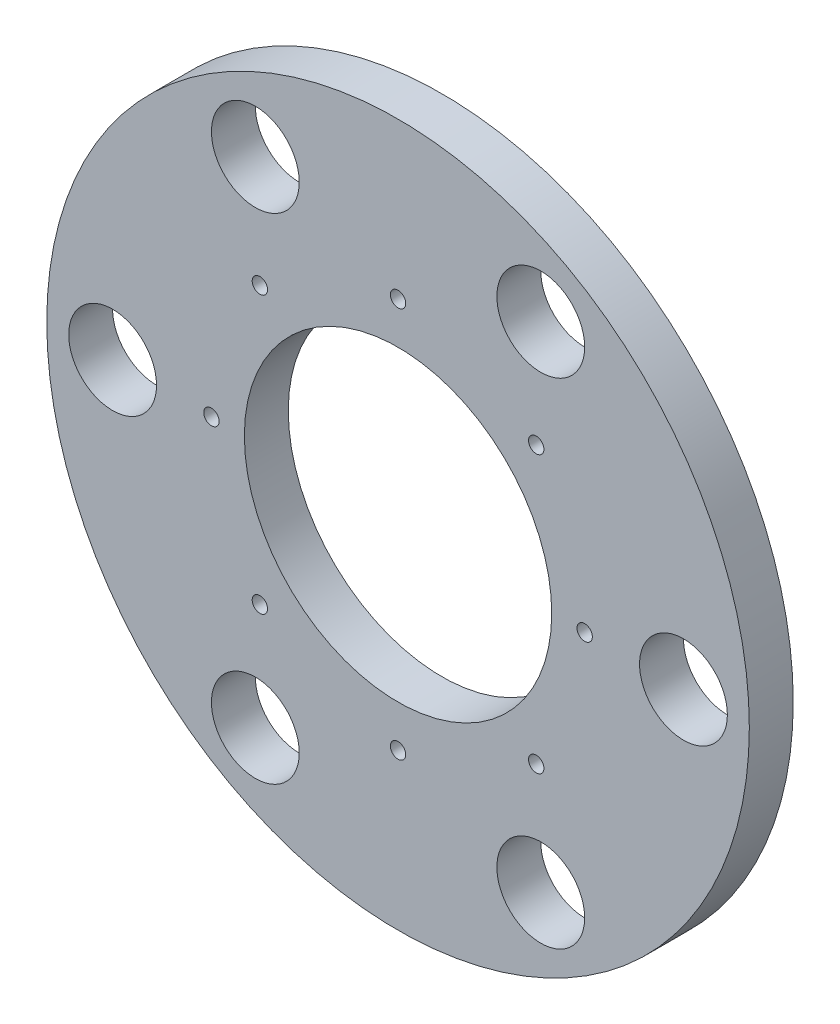
ISO-10303-21;
HEADER;
FILE_DESCRIPTION(('STEP AP214'),'2;1');
FILE_NAME('part.step','',(''),(''),'','','');
FILE_SCHEMA(('AUTOMOTIVE_DESIGN { 1 0 10303 214 1 1 1 1 }'));
ENDSEC;
DATA;
#1=APPLICATION_CONTEXT('core data for automotive mechanical design processes');
#2=APPLICATION_PROTOCOL_DEFINITION('international standard','automotive_design',2000,#1);
#3=PRODUCT_CONTEXT('',#1,'mechanical');
#4=PRODUCT('Part','Part','',(#3));
#5=PRODUCT_RELATED_PRODUCT_CATEGORY('part','',(#4));
#6=PRODUCT_DEFINITION_FORMATION('','',#4);
#7=PRODUCT_DEFINITION_CONTEXT('part definition',#1,'design');
#8=PRODUCT_DEFINITION('design','',#6,#7);
#9=PRODUCT_DEFINITION_SHAPE('','',#8);
#10=(LENGTH_UNIT() NAMED_UNIT(*) SI_UNIT(.MILLI.,.METRE.));
#11=(NAMED_UNIT(*) PLANE_ANGLE_UNIT() SI_UNIT($,.RADIAN.));
#12=(NAMED_UNIT(*) SI_UNIT($,.STERADIAN.) SOLID_ANGLE_UNIT());
#13=UNCERTAINTY_MEASURE_WITH_UNIT(LENGTH_MEASURE(1.E-05),#10,'distance_accuracy_value','');
#14=(GEOMETRIC_REPRESENTATION_CONTEXT(3) GLOBAL_UNCERTAINTY_ASSIGNED_CONTEXT((#13)) GLOBAL_UNIT_ASSIGNED_CONTEXT((#10,
#11,#12)) REPRESENTATION_CONTEXT('',''));
#15=CARTESIAN_POINT('',(0.,0.,0.));
#16=DIRECTION('',(0.,0.,1.));
#17=DIRECTION('',(1.,0.,0.));
#18=AXIS2_PLACEMENT_3D('',#15,#16,#17);
#19=CARTESIAN_POINT('',(0.,0.,-10.));
#20=DIRECTION('',(0.,0.,1.));
#21=DIRECTION('',(1.,0.,0.));
#22=AXIS2_PLACEMENT_3D('',#19,#20,#21);
#23=CYLINDRICAL_SURFACE('',#22,80.);
#24=CARTESIAN_POINT('',(0.,0.,-10.));
#25=DIRECTION('',(0.,0.,1.));
#26=DIRECTION('',(1.,0.,0.));
#27=AXIS2_PLACEMENT_3D('',#24,#25,#26);
#28=CIRCLE('',#27,80.);
#29=CARTESIAN_POINT('',(80.,0.,-10.));
#30=VERTEX_POINT('',#29);
#31=EDGE_CURVE('E10',#30,#30,#28,.T.);
#32=ORIENTED_EDGE('',*,*,#31,.T.);
#33=EDGE_LOOP('',(#32));
#34=FACE_BOUND('',#33,.T.);
#35=CARTESIAN_POINT('',(0.,0.,0.));
#36=DIRECTION('',(0.,0.,1.));
#37=DIRECTION('',(1.,0.,0.));
#38=AXIS2_PLACEMENT_3D('',#35,#36,#37);
#39=CIRCLE('',#38,80.);
#40=CARTESIAN_POINT('',(80.,0.,0.));
#41=VERTEX_POINT('',#40);
#42=EDGE_CURVE('E43',#41,#41,#39,.T.);
#43=ORIENTED_EDGE('',*,*,#42,.F.);
#44=EDGE_LOOP('',(#43));
#45=FACE_BOUND('',#44,.T.);
#46=ADVANCED_FACE('F40',(#34,#45),#23,.T.);
#47=CARTESIAN_POINT('',(0.,0.,-10.));
#48=DIRECTION('',(0.,0.,1.));
#49=DIRECTION('',(1.,0.,0.));
#50=AXIS2_PLACEMENT_3D('',#47,#48,#49);
#51=PLANE('',#50);
#52=CARTESIAN_POINT('',(0.,0.,-10.));
#53=DIRECTION('',(0.,0.,1.));
#54=DIRECTION('',(1.,0.,0.));
#55=AXIS2_PLACEMENT_3D('',#52,#53,#54);
#56=CIRCLE('',#55,35.);
#57=CARTESIAN_POINT('',(35.,0.,-10.));
#58=VERTEX_POINT('',#57);
#59=EDGE_CURVE('E145',#58,#58,#56,.T.);
#60=ORIENTED_EDGE('',*,*,#59,.T.);
#61=EDGE_LOOP('',(#60));
#62=FACE_BOUND('',#61,.T.);
#63=CARTESIAN_POINT('',(1.55370919578519E-13,44.5,-10.));
#64=DIRECTION('',(0.,0.,1.));
#65=DIRECTION('',(1.,0.,0.));
#66=AXIS2_PLACEMENT_3D('',#63,#64,#65);
#67=CIRCLE('',#66,1.75);
#68=CARTESIAN_POINT('',(1.75000000000016,44.5,-10.));
#69=VERTEX_POINT('',#68);
#70=EDGE_CURVE('E71',#69,#69,#67,.T.);
#71=ORIENTED_EDGE('',*,*,#70,.T.);
#72=EDGE_LOOP('',(#71));
#73=FACE_BOUND('',#72,.T.);
#74=CARTESIAN_POINT('',(-4.66112758735558E-13,-44.5,-10.));
#75=DIRECTION('',(0.,0.,1.));
#76=DIRECTION('',(1.,0.,0.));
#77=AXIS2_PLACEMENT_3D('',#74,#75,#76);
#78=CIRCLE('',#77,1.75000000000001);
#79=CARTESIAN_POINT('',(1.74999999999954,-44.5,-10.));
#80=VERTEX_POINT('',#79);
#81=EDGE_CURVE('E140',#80,#80,#78,.T.);
#82=ORIENTED_EDGE('',*,*,#81,.T.);
#83=EDGE_LOOP('',(#82));
#84=FACE_BOUND('',#83,.T.);
#85=CARTESIAN_POINT('',(-31.4662517628013,31.4662517628014,-10.));
#86=DIRECTION('',(0.,0.,1.));
#87=DIRECTION('',(1.,0.,0.));
#88=AXIS2_PLACEMENT_3D('',#85,#86,#87);
#89=CIRCLE('',#88,1.75);
#90=CARTESIAN_POINT('',(-29.7162517628013,31.4662517628014,-10.));
#91=VERTEX_POINT('',#90);
#92=EDGE_CURVE('E149',#91,#91,#89,.T.);
#93=ORIENTED_EDGE('',*,*,#92,.T.);
#94=EDGE_LOOP('',(#93));
#95=FACE_BOUND('',#94,.T.);
#96=CARTESIAN_POINT('',(-42.5,0.,-10.));
#97=DIRECTION('',(0.,0.,1.));
#98=DIRECTION('',(1.,0.,0.));
#99=AXIS2_PLACEMENT_3D('',#96,#97,#98);
#100=CIRCLE('',#99,1.75);
#101=CARTESIAN_POINT('',(-40.75,0.,-10.));
#102=VERTEX_POINT('',#101);
#103=EDGE_CURVE('E157',#102,#102,#100,.T.);
#104=ORIENTED_EDGE('',*,*,#103,.T.);
#105=EDGE_LOOP('',(#104));
#106=FACE_BOUND('',#105,.T.);
#107=CARTESIAN_POINT('',(-31.4662517628018,-31.466251762801,-10.));
#108=DIRECTION('',(0.,0.,1.));
#109=DIRECTION('',(1.,0.,0.));
#110=AXIS2_PLACEMENT_3D('',#107,#108,#109);
#111=CIRCLE('',#110,1.75);
#112=CARTESIAN_POINT('',(-29.7162517628018,-31.466251762801,-10.));
#113=VERTEX_POINT('',#112);
#114=EDGE_CURVE('E106',#113,#113,#111,.T.);
#115=ORIENTED_EDGE('',*,*,#114,.T.);
#116=EDGE_LOOP('',(#115));
#117=FACE_BOUND('',#116,.T.);
#118=CARTESIAN_POINT('',(31.4662517628011,-31.4662517628016,-10.));
#119=DIRECTION('',(0.,0.,1.));
#120=DIRECTION('',(1.,0.,0.));
#121=AXIS2_PLACEMENT_3D('',#118,#119,#120);
#122=CIRCLE('',#121,1.75);
#123=CARTESIAN_POINT('',(33.2162517628011,-31.4662517628016,-10.));
#124=VERTEX_POINT('',#123);
#125=EDGE_CURVE('E115',#124,#124,#122,.T.);
#126=ORIENTED_EDGE('',*,*,#125,.T.);
#127=EDGE_LOOP('',(#126));
#128=FACE_BOUND('',#127,.T.);
#129=CARTESIAN_POINT('',(42.5,-2.9157116490529E-13,-10.));
#130=DIRECTION('',(0.,0.,1.));
#131=DIRECTION('',(1.,0.,0.));
#132=AXIS2_PLACEMENT_3D('',#129,#130,#131);
#133=CIRCLE('',#132,1.75);
#134=CARTESIAN_POINT('',(44.25,-2.9157116490529E-13,-10.));
#135=VERTEX_POINT('',#134);
#136=EDGE_CURVE('E123',#135,#135,#133,.T.);
#137=ORIENTED_EDGE('',*,*,#136,.T.);
#138=EDGE_LOOP('',(#137));
#139=FACE_BOUND('',#138,.T.);
#140=CARTESIAN_POINT('',(31.4662517628015,31.4662517628012,-10.));
#141=DIRECTION('',(0.,0.,1.));
#142=DIRECTION('',(1.,0.,0.));
#143=AXIS2_PLACEMENT_3D('',#140,#141,#142);
#144=CIRCLE('',#143,1.75);
#145=CARTESIAN_POINT('',(33.2162517628015,31.4662517628012,-10.));
#146=VERTEX_POINT('',#145);
#147=EDGE_CURVE('E131',#146,#146,#144,.T.);
#148=ORIENTED_EDGE('',*,*,#147,.T.);
#149=EDGE_LOOP('',(#148));
#150=FACE_BOUND('',#149,.T.);
#151=CARTESIAN_POINT('',(32.5000000000003,56.2916512459884,-10.));
#152=DIRECTION('',(0.,0.,1.));
#153=DIRECTION('',(1.,0.,0.));
#154=AXIS2_PLACEMENT_3D('',#151,#152,#153);
#155=CIRCLE('',#154,10.);
#156=CARTESIAN_POINT('',(42.5000000000003,56.2916512459884,-10.));
#157=VERTEX_POINT('',#156);
#158=EDGE_CURVE('E70',#157,#157,#155,.T.);
#159=ORIENTED_EDGE('',*,*,#158,.T.);
#160=EDGE_LOOP('',(#159));
#161=FACE_BOUND('',#160,.T.);
#162=CARTESIAN_POINT('',(65.,-4.45932369855149E-13,-10.));
#163=DIRECTION('',(0.,0.,1.));
#164=DIRECTION('',(1.,0.,0.));
#165=AXIS2_PLACEMENT_3D('',#162,#163,#164);
#166=CIRCLE('',#165,10.);
#167=CARTESIAN_POINT('',(75.,-4.45932369855149E-13,-10.));
#168=VERTEX_POINT('',#167);
#169=EDGE_CURVE('E79',#168,#168,#166,.T.);
#170=ORIENTED_EDGE('',*,*,#169,.T.);
#171=EDGE_LOOP('',(#170));
#172=FACE_BOUND('',#171,.T.);
#173=CARTESIAN_POINT('',(32.4999999999995,-56.2916512459888,-10.));
#174=DIRECTION('',(0.,0.,1.));
#175=DIRECTION('',(1.,0.,0.));
#176=AXIS2_PLACEMENT_3D('',#173,#174,#175);
#177=CIRCLE('',#176,10.);
#178=CARTESIAN_POINT('',(42.4999999999995,-56.2916512459888,-10.));
#179=VERTEX_POINT('',#178);
#180=EDGE_CURVE('E87',#179,#179,#177,.T.);
#181=ORIENTED_EDGE('',*,*,#180,.T.);
#182=EDGE_LOOP('',(#181));
#183=FACE_BOUND('',#182,.T.);
#184=CARTESIAN_POINT('',(-32.5000000000007,-56.2916512459882,-10.));
#185=DIRECTION('',(0.,0.,1.));
#186=DIRECTION('',(1.,0.,0.));
#187=AXIS2_PLACEMENT_3D('',#184,#185,#186);
#188=CIRCLE('',#187,10.);
#189=CARTESIAN_POINT('',(-22.5000000000006,-56.2916512459882,-10.));
#190=VERTEX_POINT('',#189);
#191=EDGE_CURVE('E95',#190,#190,#188,.T.);
#192=ORIENTED_EDGE('',*,*,#191,.T.);
#193=EDGE_LOOP('',(#192));
#194=FACE_BOUND('',#193,.T.);
#195=CARTESIAN_POINT('',(-65.,0.,-10.));
#196=DIRECTION('',(0.,0.,1.));
#197=DIRECTION('',(1.,0.,0.));
#198=AXIS2_PLACEMENT_3D('',#195,#196,#197);
#199=CIRCLE('',#198,10.);
#200=CARTESIAN_POINT('',(-55.,0.,-10.));
#201=VERTEX_POINT('',#200);
#202=EDGE_CURVE('E62',#201,#201,#199,.T.);
#203=ORIENTED_EDGE('',*,*,#202,.T.);
#204=EDGE_LOOP('',(#203));
#205=FACE_BOUND('',#204,.T.);
#206=CARTESIAN_POINT('',(-32.4999999999999,56.2916512459886,-10.));
#207=DIRECTION('',(0.,0.,1.));
#208=DIRECTION('',(1.,0.,0.));
#209=AXIS2_PLACEMENT_3D('',#206,#207,#208);
#210=CIRCLE('',#209,10.);
#211=CARTESIAN_POINT('',(-22.4999999999999,56.2916512459886,-10.));
#212=VERTEX_POINT('',#211);
#213=EDGE_CURVE('E57',#212,#212,#210,.T.);
#214=ORIENTED_EDGE('',*,*,#213,.T.);
#215=EDGE_LOOP('',(#214));
#216=FACE_BOUND('',#215,.T.);
#217=ORIENTED_EDGE('',*,*,#31,.F.);
#218=EDGE_LOOP('',(#217));
#219=FACE_BOUND('',#218,.T.);
#220=ADVANCED_FACE('F174',(#62,#73,#84,#95,#106,#117,#128,#139,#150,#161,#172,#183,#194,#205,
#216,#219),#51,.F.);
#221=CARTESIAN_POINT('',(0.,0.,0.));
#222=DIRECTION('',(0.,0.,1.));
#223=DIRECTION('',(1.,0.,0.));
#224=AXIS2_PLACEMENT_3D('',#221,#222,#223);
#225=PLANE('',#224);
#226=CARTESIAN_POINT('',(1.55370919578519E-13,44.5,0.));
#227=DIRECTION('',(0.,0.,1.));
#228=DIRECTION('',(1.,0.,0.));
#229=AXIS2_PLACEMENT_3D('',#226,#227,#228);
#230=CIRCLE('',#229,1.75);
#231=CARTESIAN_POINT('',(1.75000000000016,44.5,0.));
#232=VERTEX_POINT('',#231);
#233=EDGE_CURVE('E139',#232,#232,#230,.T.);
#234=ORIENTED_EDGE('',*,*,#233,.F.);
#235=EDGE_LOOP('',(#234));
#236=FACE_BOUND('',#235,.T.);
#237=CARTESIAN_POINT('',(-4.66112758735558E-13,-44.5,0.));
#238=DIRECTION('',(0.,0.,1.));
#239=DIRECTION('',(1.,0.,0.));
#240=AXIS2_PLACEMENT_3D('',#237,#238,#239);
#241=CIRCLE('',#240,1.75000000000001);
#242=CARTESIAN_POINT('',(1.74999999999954,-44.5,0.));
#243=VERTEX_POINT('',#242);
#244=EDGE_CURVE('E144',#243,#243,#241,.T.);
#245=ORIENTED_EDGE('',*,*,#244,.F.);
#246=EDGE_LOOP('',(#245));
#247=FACE_BOUND('',#246,.T.);
#248=CARTESIAN_POINT('',(-31.4662517628013,31.4662517628014,0.));
#249=DIRECTION('',(0.,0.,1.));
#250=DIRECTION('',(1.,0.,0.));
#251=AXIS2_PLACEMENT_3D('',#248,#249,#250);
#252=CIRCLE('',#251,1.75);
#253=CARTESIAN_POINT('',(-29.7162517628013,31.4662517628014,0.));
#254=VERTEX_POINT('',#253);
#255=EDGE_CURVE('E153',#254,#254,#252,.T.);
#256=ORIENTED_EDGE('',*,*,#255,.F.);
#257=EDGE_LOOP('',(#256));
#258=FACE_BOUND('',#257,.T.);
#259=CARTESIAN_POINT('',(-42.5,0.,0.));
#260=DIRECTION('',(0.,0.,1.));
#261=DIRECTION('',(1.,0.,0.));
#262=AXIS2_PLACEMENT_3D('',#259,#260,#261);
#263=CIRCLE('',#262,1.75);
#264=CARTESIAN_POINT('',(-40.75,0.,0.));
#265=VERTEX_POINT('',#264);
#266=EDGE_CURVE('E111',#265,#265,#263,.T.);
#267=ORIENTED_EDGE('',*,*,#266,.F.);
#268=EDGE_LOOP('',(#267));
#269=FACE_BOUND('',#268,.T.);
#270=CARTESIAN_POINT('',(-31.4662517628018,-31.466251762801,0.));
#271=DIRECTION('',(0.,0.,1.));
#272=DIRECTION('',(1.,0.,0.));
#273=AXIS2_PLACEMENT_3D('',#270,#271,#272);
#274=CIRCLE('',#273,1.75);
#275=CARTESIAN_POINT('',(-29.7162517628018,-31.466251762801,0.));
#276=VERTEX_POINT('',#275);
#277=EDGE_CURVE('E110',#276,#276,#274,.T.);
#278=ORIENTED_EDGE('',*,*,#277,.F.);
#279=EDGE_LOOP('',(#278));
#280=FACE_BOUND('',#279,.T.);
#281=CARTESIAN_POINT('',(31.4662517628011,-31.4662517628016,0.));
#282=DIRECTION('',(0.,0.,1.));
#283=DIRECTION('',(1.,0.,0.));
#284=AXIS2_PLACEMENT_3D('',#281,#282,#283);
#285=CIRCLE('',#284,1.75);
#286=CARTESIAN_POINT('',(33.2162517628011,-31.4662517628016,0.));
#287=VERTEX_POINT('',#286);
#288=EDGE_CURVE('E119',#287,#287,#285,.T.);
#289=ORIENTED_EDGE('',*,*,#288,.F.);
#290=EDGE_LOOP('',(#289));
#291=FACE_BOUND('',#290,.T.);
#292=CARTESIAN_POINT('',(42.5,-2.9157116490529E-13,0.));
#293=DIRECTION('',(0.,0.,1.));
#294=DIRECTION('',(1.,0.,0.));
#295=AXIS2_PLACEMENT_3D('',#292,#293,#294);
#296=CIRCLE('',#295,1.75);
#297=CARTESIAN_POINT('',(44.25,-2.9157116490529E-13,0.));
#298=VERTEX_POINT('',#297);
#299=EDGE_CURVE('E127',#298,#298,#296,.T.);
#300=ORIENTED_EDGE('',*,*,#299,.F.);
#301=EDGE_LOOP('',(#300));
#302=FACE_BOUND('',#301,.T.);
#303=CARTESIAN_POINT('',(31.4662517628015,31.4662517628012,0.));
#304=DIRECTION('',(0.,0.,1.));
#305=DIRECTION('',(1.,0.,0.));
#306=AXIS2_PLACEMENT_3D('',#303,#304,#305);
#307=CIRCLE('',#306,1.75);
#308=CARTESIAN_POINT('',(33.2162517628015,31.4662517628012,0.));
#309=VERTEX_POINT('',#308);
#310=EDGE_CURVE('E135',#309,#309,#307,.T.);
#311=ORIENTED_EDGE('',*,*,#310,.F.);
#312=EDGE_LOOP('',(#311));
#313=FACE_BOUND('',#312,.T.);
#314=CARTESIAN_POINT('',(32.5000000000003,56.2916512459884,0.));
#315=DIRECTION('',(0.,0.,1.));
#316=DIRECTION('',(1.,0.,0.));
#317=AXIS2_PLACEMENT_3D('',#314,#315,#316);
#318=CIRCLE('',#317,10.);
#319=CARTESIAN_POINT('',(42.5000000000003,56.2916512459884,0.));
#320=VERTEX_POINT('',#319);
#321=EDGE_CURVE('E66',#320,#320,#318,.T.);
#322=ORIENTED_EDGE('',*,*,#321,.F.);
#323=EDGE_LOOP('',(#322));
#324=FACE_BOUND('',#323,.T.);
#325=CARTESIAN_POINT('',(65.,-4.45932369855149E-13,0.));
#326=DIRECTION('',(0.,0.,1.));
#327=DIRECTION('',(1.,0.,0.));
#328=AXIS2_PLACEMENT_3D('',#325,#326,#327);
#329=CIRCLE('',#328,10.);
#330=CARTESIAN_POINT('',(75.,-4.45932369855149E-13,0.));
#331=VERTEX_POINT('',#330);
#332=EDGE_CURVE('E75',#331,#331,#329,.T.);
#333=ORIENTED_EDGE('',*,*,#332,.F.);
#334=EDGE_LOOP('',(#333));
#335=FACE_BOUND('',#334,.T.);
#336=CARTESIAN_POINT('',(32.4999999999995,-56.2916512459888,0.));
#337=DIRECTION('',(0.,0.,1.));
#338=DIRECTION('',(1.,0.,0.));
#339=AXIS2_PLACEMENT_3D('',#336,#337,#338);
#340=CIRCLE('',#339,10.);
#341=CARTESIAN_POINT('',(42.4999999999995,-56.2916512459888,0.));
#342=VERTEX_POINT('',#341);
#343=EDGE_CURVE('E83',#342,#342,#340,.T.);
#344=ORIENTED_EDGE('',*,*,#343,.F.);
#345=EDGE_LOOP('',(#344));
#346=FACE_BOUND('',#345,.T.);
#347=CARTESIAN_POINT('',(-32.5000000000007,-56.2916512459882,0.));
#348=DIRECTION('',(0.,0.,1.));
#349=DIRECTION('',(1.,0.,0.));
#350=AXIS2_PLACEMENT_3D('',#347,#348,#349);
#351=CIRCLE('',#350,10.);
#352=CARTESIAN_POINT('',(-22.5000000000006,-56.2916512459882,0.));
#353=VERTEX_POINT('',#352);
#354=EDGE_CURVE('E91',#353,#353,#351,.T.);
#355=ORIENTED_EDGE('',*,*,#354,.F.);
#356=EDGE_LOOP('',(#355));
#357=FACE_BOUND('',#356,.T.);
#358=CARTESIAN_POINT('',(-65.,0.,0.));
#359=DIRECTION('',(0.,0.,1.));
#360=DIRECTION('',(1.,0.,0.));
#361=AXIS2_PLACEMENT_3D('',#358,#359,#360);
#362=CIRCLE('',#361,10.);
#363=CARTESIAN_POINT('',(-55.,0.,0.));
#364=VERTEX_POINT('',#363);
#365=EDGE_CURVE('E99',#364,#364,#362,.T.);
#366=ORIENTED_EDGE('',*,*,#365,.F.);
#367=EDGE_LOOP('',(#366));
#368=FACE_BOUND('',#367,.T.);
#369=CARTESIAN_POINT('',(-32.4999999999999,56.2916512459886,0.));
#370=DIRECTION('',(0.,0.,1.));
#371=DIRECTION('',(1.,0.,0.));
#372=AXIS2_PLACEMENT_3D('',#369,#370,#371);
#373=CIRCLE('',#372,10.);
#374=CARTESIAN_POINT('',(-22.4999999999999,56.2916512459886,0.));
#375=VERTEX_POINT('',#374);
#376=EDGE_CURVE('E58',#375,#375,#373,.T.);
#377=ORIENTED_EDGE('',*,*,#376,.F.);
#378=EDGE_LOOP('',(#377));
#379=FACE_BOUND('',#378,.T.);
#380=CARTESIAN_POINT('',(0.,0.,0.));
#381=DIRECTION('',(0.,0.,1.));
#382=DIRECTION('',(1.,0.,0.));
#383=AXIS2_PLACEMENT_3D('',#380,#381,#382);
#384=CIRCLE('',#383,35.);
#385=CARTESIAN_POINT('',(35.,0.,0.));
#386=VERTEX_POINT('',#385);
#387=EDGE_CURVE('E52',#386,#386,#384,.T.);
#388=ORIENTED_EDGE('',*,*,#387,.F.);
#389=EDGE_LOOP('',(#388));
#390=FACE_BOUND('',#389,.T.);
#391=ORIENTED_EDGE('',*,*,#42,.T.);
#392=EDGE_LOOP('',(#391));
#393=FACE_BOUND('',#392,.T.);
#394=ADVANCED_FACE('F180',(#236,#247,#258,#269,#280,#291,#302,#313,#324,#335,#346,#357,#368,
#379,#390,#393),#225,.T.);
#395=CARTESIAN_POINT('',(0.,0.,-7.));
#396=DIRECTION('',(0.,0.,1.));
#397=DIRECTION('',(1.,0.,0.));
#398=AXIS2_PLACEMENT_3D('',#395,#396,#397);
#399=CYLINDRICAL_SURFACE('',#398,35.);
#400=ORIENTED_EDGE('',*,*,#387,.T.);
#401=EDGE_LOOP('',(#400));
#402=FACE_BOUND('',#401,.T.);
#403=ORIENTED_EDGE('',*,*,#59,.F.);
#404=EDGE_LOOP('',(#403));
#405=FACE_BOUND('',#404,.T.);
#406=ADVANCED_FACE('F177',(#402,#405),#399,.F.);
#407=CARTESIAN_POINT('',(-32.4999999999999,56.2916512459886,-10.));
#408=DIRECTION('',(0.,0.,1.));
#409=DIRECTION('',(1.,0.,0.));
#410=AXIS2_PLACEMENT_3D('',#407,#408,#409);
#411=CYLINDRICAL_SURFACE('',#410,10.);
#412=ORIENTED_EDGE('',*,*,#213,.F.);
#413=EDGE_LOOP('',(#412));
#414=FACE_BOUND('',#413,.T.);
#415=ORIENTED_EDGE('',*,*,#376,.T.);
#416=EDGE_LOOP('',(#415));
#417=FACE_BOUND('',#416,.T.);
#418=ADVANCED_FACE('F179',(#414,#417),#411,.F.);
#419=CARTESIAN_POINT('',(-65.,0.,-10.));
#420=DIRECTION('',(0.,0.,1.));
#421=DIRECTION('',(1.,0.,0.));
#422=AXIS2_PLACEMENT_3D('',#419,#420,#421);
#423=CYLINDRICAL_SURFACE('',#422,10.);
#424=ORIENTED_EDGE('',*,*,#202,.F.);
#425=EDGE_LOOP('',(#424));
#426=FACE_BOUND('',#425,.T.);
#427=ORIENTED_EDGE('',*,*,#365,.T.);
#428=EDGE_LOOP('',(#427));
#429=FACE_BOUND('',#428,.T.);
#430=ADVANCED_FACE('F187',(#426,#429),#423,.F.);
#431=CARTESIAN_POINT('',(-32.5000000000007,-56.2916512459882,-10.));
#432=DIRECTION('',(0.,0.,1.));
#433=DIRECTION('',(1.,0.,0.));
#434=AXIS2_PLACEMENT_3D('',#431,#432,#433);
#435=CYLINDRICAL_SURFACE('',#434,10.);
#436=ORIENTED_EDGE('',*,*,#191,.F.);
#437=EDGE_LOOP('',(#436));
#438=FACE_BOUND('',#437,.T.);
#439=ORIENTED_EDGE('',*,*,#354,.T.);
#440=EDGE_LOOP('',(#439));
#441=FACE_BOUND('',#440,.T.);
#442=ADVANCED_FACE('F332',(#438,#441),#435,.F.);
#443=CARTESIAN_POINT('',(32.4999999999995,-56.2916512459888,-10.));
#444=DIRECTION('',(0.,0.,1.));
#445=DIRECTION('',(1.,0.,0.));
#446=AXIS2_PLACEMENT_3D('',#443,#444,#445);
#447=CYLINDRICAL_SURFACE('',#446,10.);
#448=ORIENTED_EDGE('',*,*,#180,.F.);
#449=EDGE_LOOP('',(#448));
#450=FACE_BOUND('',#449,.T.);
#451=ORIENTED_EDGE('',*,*,#343,.T.);
#452=EDGE_LOOP('',(#451));
#453=FACE_BOUND('',#452,.T.);
#454=ADVANCED_FACE('F321',(#450,#453),#447,.F.);
#455=CARTESIAN_POINT('',(65.,-4.45932369855149E-13,-10.));
#456=DIRECTION('',(0.,0.,1.));
#457=DIRECTION('',(1.,0.,0.));
#458=AXIS2_PLACEMENT_3D('',#455,#456,#457);
#459=CYLINDRICAL_SURFACE('',#458,10.);
#460=ORIENTED_EDGE('',*,*,#169,.F.);
#461=EDGE_LOOP('',(#460));
#462=FACE_BOUND('',#461,.T.);
#463=ORIENTED_EDGE('',*,*,#332,.T.);
#464=EDGE_LOOP('',(#463));
#465=FACE_BOUND('',#464,.T.);
#466=ADVANCED_FACE('F310',(#462,#465),#459,.F.);
#467=CARTESIAN_POINT('',(32.5000000000003,56.2916512459884,-10.));
#468=DIRECTION('',(0.,0.,1.));
#469=DIRECTION('',(1.,0.,0.));
#470=AXIS2_PLACEMENT_3D('',#467,#468,#469);
#471=CYLINDRICAL_SURFACE('',#470,10.);
#472=ORIENTED_EDGE('',*,*,#158,.F.);
#473=EDGE_LOOP('',(#472));
#474=FACE_BOUND('',#473,.T.);
#475=ORIENTED_EDGE('',*,*,#321,.T.);
#476=EDGE_LOOP('',(#475));
#477=FACE_BOUND('',#476,.T.);
#478=ADVANCED_FACE('F298',(#474,#477),#471,.F.);
#479=CARTESIAN_POINT('',(31.4662517628015,31.4662517628012,-10.));
#480=DIRECTION('',(0.,0.,1.));
#481=DIRECTION('',(1.,0.,0.));
#482=AXIS2_PLACEMENT_3D('',#479,#480,#481);
#483=CYLINDRICAL_SURFACE('',#482,1.75);
#484=ORIENTED_EDGE('',*,*,#147,.F.);
#485=EDGE_LOOP('',(#484));
#486=FACE_BOUND('',#485,.T.);
#487=ORIENTED_EDGE('',*,*,#310,.T.);
#488=EDGE_LOOP('',(#487));
#489=FACE_BOUND('',#488,.T.);
#490=ADVANCED_FACE('F287',(#486,#489),#483,.F.);
#491=CARTESIAN_POINT('',(42.5,-2.9157116490529E-13,-10.));
#492=DIRECTION('',(0.,0.,1.));
#493=DIRECTION('',(1.,0.,0.));
#494=AXIS2_PLACEMENT_3D('',#491,#492,#493);
#495=CYLINDRICAL_SURFACE('',#494,1.75);
#496=ORIENTED_EDGE('',*,*,#136,.F.);
#497=EDGE_LOOP('',(#496));
#498=FACE_BOUND('',#497,.T.);
#499=ORIENTED_EDGE('',*,*,#299,.T.);
#500=EDGE_LOOP('',(#499));
#501=FACE_BOUND('',#500,.T.);
#502=ADVANCED_FACE('F276',(#498,#501),#495,.F.);
#503=CARTESIAN_POINT('',(31.4662517628011,-31.4662517628016,-10.));
#504=DIRECTION('',(0.,0.,1.));
#505=DIRECTION('',(1.,0.,0.));
#506=AXIS2_PLACEMENT_3D('',#503,#504,#505);
#507=CYLINDRICAL_SURFACE('',#506,1.75);
#508=ORIENTED_EDGE('',*,*,#125,.F.);
#509=EDGE_LOOP('',(#508));
#510=FACE_BOUND('',#509,.T.);
#511=ORIENTED_EDGE('',*,*,#288,.T.);
#512=EDGE_LOOP('',(#511));
#513=FACE_BOUND('',#512,.T.);
#514=ADVANCED_FACE('F265',(#510,#513),#507,.F.);
#515=CARTESIAN_POINT('',(-31.4662517628018,-31.466251762801,-10.));
#516=DIRECTION('',(0.,0.,1.));
#517=DIRECTION('',(1.,0.,0.));
#518=AXIS2_PLACEMENT_3D('',#515,#516,#517);
#519=CYLINDRICAL_SURFACE('',#518,1.75);
#520=ORIENTED_EDGE('',*,*,#114,.F.);
#521=EDGE_LOOP('',(#520));
#522=FACE_BOUND('',#521,.T.);
#523=ORIENTED_EDGE('',*,*,#277,.T.);
#524=EDGE_LOOP('',(#523));
#525=FACE_BOUND('',#524,.T.);
#526=ADVANCED_FACE('F254',(#522,#525),#519,.F.);
#527=CARTESIAN_POINT('',(-42.5,0.,-10.));
#528=DIRECTION('',(0.,0.,1.));
#529=DIRECTION('',(1.,0.,0.));
#530=AXIS2_PLACEMENT_3D('',#527,#528,#529);
#531=CYLINDRICAL_SURFACE('',#530,1.75);
#532=ORIENTED_EDGE('',*,*,#103,.F.);
#533=EDGE_LOOP('',(#532));
#534=FACE_BOUND('',#533,.T.);
#535=ORIENTED_EDGE('',*,*,#266,.T.);
#536=EDGE_LOOP('',(#535));
#537=FACE_BOUND('',#536,.T.);
#538=ADVANCED_FACE('F243',(#534,#537),#531,.F.);
#539=CARTESIAN_POINT('',(-31.4662517628013,31.4662517628014,-10.));
#540=DIRECTION('',(0.,0.,1.));
#541=DIRECTION('',(1.,0.,0.));
#542=AXIS2_PLACEMENT_3D('',#539,#540,#541);
#543=CYLINDRICAL_SURFACE('',#542,1.75);
#544=ORIENTED_EDGE('',*,*,#92,.F.);
#545=EDGE_LOOP('',(#544));
#546=FACE_BOUND('',#545,.T.);
#547=ORIENTED_EDGE('',*,*,#255,.T.);
#548=EDGE_LOOP('',(#547));
#549=FACE_BOUND('',#548,.T.);
#550=ADVANCED_FACE('F232',(#546,#549),#543,.F.);
#551=CARTESIAN_POINT('',(-4.66112758735558E-13,-44.5,-10.));
#552=DIRECTION('',(0.,0.,1.));
#553=DIRECTION('',(1.,0.,0.));
#554=AXIS2_PLACEMENT_3D('',#551,#552,#553);
#555=CYLINDRICAL_SURFACE('',#554,1.75000000000001);
#556=ORIENTED_EDGE('',*,*,#81,.F.);
#557=EDGE_LOOP('',(#556));
#558=FACE_BOUND('',#557,.T.);
#559=ORIENTED_EDGE('',*,*,#244,.T.);
#560=EDGE_LOOP('',(#559));
#561=FACE_BOUND('',#560,.T.);
#562=ADVANCED_FACE('F223',(#558,#561),#555,.F.);
#563=CARTESIAN_POINT('',(1.55370919578519E-13,44.5,-10.));
#564=DIRECTION('',(0.,0.,1.));
#565=DIRECTION('',(1.,0.,0.));
#566=AXIS2_PLACEMENT_3D('',#563,#564,#565);
#567=CYLINDRICAL_SURFACE('',#566,1.75);
#568=ORIENTED_EDGE('',*,*,#70,.F.);
#569=EDGE_LOOP('',(#568));
#570=FACE_BOUND('',#569,.T.);
#571=ORIENTED_EDGE('',*,*,#233,.T.);
#572=EDGE_LOOP('',(#571));
#573=FACE_BOUND('',#572,.T.);
#574=ADVANCED_FACE('F205',(#570,#573),#567,.F.);
#575=CLOSED_SHELL('',(#46,#220,#394,#406,#418,#430,#442,#454,#466,#478,#490,#502,#514,#526,#538,
#550,#562,#574));
#576=MANIFOLD_SOLID_BREP('B2',#575);
#577=ADVANCED_BREP_SHAPE_REPRESENTATION('',(#18,#576),#14);
#578=SHAPE_DEFINITION_REPRESENTATION(#9,#577);
ENDSEC;
END-ISO-10303-21;
